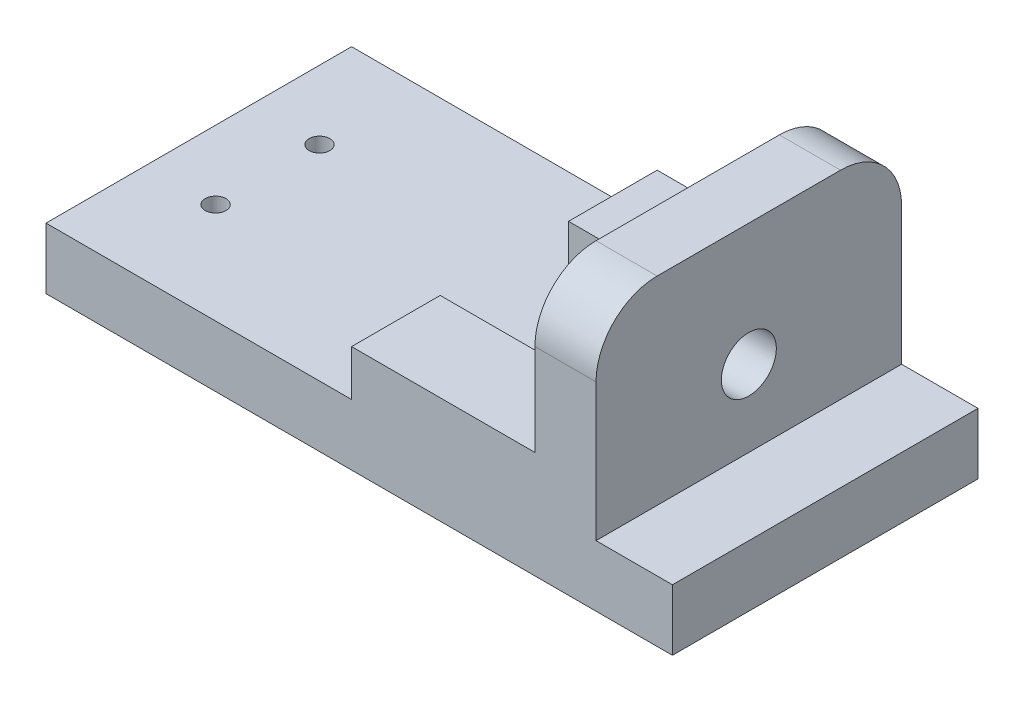
ISO-10303-21;
HEADER;
FILE_DESCRIPTION(('STEP AP214'),'2;1');
FILE_NAME('part.step','',(''),(''),'','','');
FILE_SCHEMA(('AUTOMOTIVE_DESIGN { 1 0 10303 214 1 1 1 1 }'));
ENDSEC;
DATA;
#1=APPLICATION_CONTEXT('core data for automotive mechanical design processes');
#2=APPLICATION_PROTOCOL_DEFINITION('international standard','automotive_design',2000,#1);
#3=PRODUCT_CONTEXT('',#1,'mechanical');
#4=PRODUCT('Part','Part','',(#3));
#5=PRODUCT_RELATED_PRODUCT_CATEGORY('part','',(#4));
#6=PRODUCT_DEFINITION_FORMATION('','',#4);
#7=PRODUCT_DEFINITION_CONTEXT('part definition',#1,'design');
#8=PRODUCT_DEFINITION('design','',#6,#7);
#9=PRODUCT_DEFINITION_SHAPE('','',#8);
#10=(LENGTH_UNIT() NAMED_UNIT(*) SI_UNIT(.MILLI.,.METRE.));
#11=(NAMED_UNIT(*) PLANE_ANGLE_UNIT() SI_UNIT($,.RADIAN.));
#12=(NAMED_UNIT(*) SI_UNIT($,.STERADIAN.) SOLID_ANGLE_UNIT());
#13=UNCERTAINTY_MEASURE_WITH_UNIT(LENGTH_MEASURE(1.E-05),#10,'distance_accuracy_value','');
#14=(GEOMETRIC_REPRESENTATION_CONTEXT(3) GLOBAL_UNCERTAINTY_ASSIGNED_CONTEXT((#13)) GLOBAL_UNIT_ASSIGNED_CONTEXT((#10,
#11,#12)) REPRESENTATION_CONTEXT('',''));
#15=CARTESIAN_POINT('',(0.,0.,0.));
#16=DIRECTION('',(0.,0.,1.));
#17=DIRECTION('',(1.,0.,0.));
#18=AXIS2_PLACEMENT_3D('',#15,#16,#17);
#19=CARTESIAN_POINT('',(0.,20.,0.));
#20=DIRECTION('',(0.,-1.,0.));
#21=DIRECTION('',(0.,0.,-1.));
#22=AXIS2_PLACEMENT_3D('',#19,#20,#21);
#23=PLANE('',#22);
#24=CARTESIAN_POINT('',(22.5,20.,-33.));
#25=DIRECTION('',(0.,1.,0.));
#26=DIRECTION('',(0.,0.,1.));
#27=AXIS2_PLACEMENT_3D('',#24,#25,#26);
#28=CIRCLE('',#27,3.4);
#29=CARTESIAN_POINT('',(22.5,20.,-29.6));
#30=VERTEX_POINT('',#29);
#31=EDGE_CURVE('E238',#30,#30,#28,.T.);
#32=ORIENTED_EDGE('',*,*,#31,.F.);
#33=EDGE_LOOP('',(#32));
#34=FACE_BOUND('',#33,.T.);
#35=CARTESIAN_POINT('',(22.5,20.,-67.));
#36=DIRECTION('',(0.,1.,0.));
#37=DIRECTION('',(0.,0.,1.));
#38=AXIS2_PLACEMENT_3D('',#35,#36,#37);
#39=CIRCLE('',#38,3.4);
#40=CARTESIAN_POINT('',(22.5,20.,-63.6));
#41=VERTEX_POINT('',#40);
#42=EDGE_CURVE('E244',#41,#41,#39,.T.);
#43=ORIENTED_EDGE('',*,*,#42,.F.);
#44=EDGE_LOOP('',(#43));
#45=FACE_BOUND('',#44,.T.);
#46=DIRECTION('',(0.,0.,1.));
#47=VECTOR('',#46,1.);
#48=CARTESIAN_POINT('',(99.9999999999999,20.,-100.));
#49=LINE('',#48,#47);
#50=CARTESIAN_POINT('',(99.9999999999999,20.,-100.));
#51=VERTEX_POINT('',#50);
#52=CARTESIAN_POINT('',(99.9999999999999,20.,-71.));
#53=VERTEX_POINT('',#52);
#54=EDGE_CURVE('E187',#51,#53,#49,.T.);
#55=ORIENTED_EDGE('',*,*,#54,.F.);
#56=DIRECTION('',(-1.,0.,0.));
#57=VECTOR('',#56,1.);
#58=CARTESIAN_POINT('',(0.,20.,-100.));
#59=LINE('',#58,#57);
#60=CARTESIAN_POINT('',(0.,20.,-100.));
#61=VERTEX_POINT('',#60);
#62=EDGE_CURVE('E171',#51,#61,#59,.T.);
#63=ORIENTED_EDGE('',*,*,#62,.T.);
#64=DIRECTION('',(0.,0.,1.));
#65=VECTOR('',#64,1.);
#66=CARTESIAN_POINT('',(0.,20.,0.));
#67=LINE('',#66,#65);
#68=CARTESIAN_POINT('',(0.,20.,0.));
#69=VERTEX_POINT('',#68);
#70=EDGE_CURVE('E251',#61,#69,#67,.T.);
#71=ORIENTED_EDGE('',*,*,#70,.T.);
#72=DIRECTION('',(1.,0.,0.));
#73=VECTOR('',#72,1.);
#74=CARTESIAN_POINT('',(0.,20.,0.));
#75=LINE('',#74,#73);
#76=CARTESIAN_POINT('',(99.9999999999999,20.,0.));
#77=VERTEX_POINT('',#76);
#78=EDGE_CURVE('E256',#69,#77,#75,.T.);
#79=ORIENTED_EDGE('',*,*,#78,.T.);
#80=DIRECTION('',(0.,0.,1.));
#81=VECTOR('',#80,1.);
#82=CARTESIAN_POINT('',(99.9999999999999,20.,0.));
#83=LINE('',#82,#81);
#84=CARTESIAN_POINT('',(99.9999999999999,20.,-29.));
#85=VERTEX_POINT('',#84);
#86=EDGE_CURVE('E199',#85,#77,#83,.T.);
#87=ORIENTED_EDGE('',*,*,#86,.F.);
#88=DIRECTION('',(-1.,0.,0.));
#89=VECTOR('',#88,1.);
#90=CARTESIAN_POINT('',(160.,20.,-29.));
#91=LINE('',#90,#89);
#92=CARTESIAN_POINT('',(160.,20.,-29.));
#93=VERTEX_POINT('',#92);
#94=EDGE_CURVE('E175',#93,#85,#91,.T.);
#95=ORIENTED_EDGE('',*,*,#94,.F.);
#96=DIRECTION('',(0.,0.,-1.));
#97=VECTOR('',#96,1.);
#98=CARTESIAN_POINT('',(160.,20.,0.));
#99=LINE('',#98,#97);
#100=CARTESIAN_POINT('',(160.,20.,-71.));
#101=VERTEX_POINT('',#100);
#102=EDGE_CURVE('E219',#93,#101,#99,.T.);
#103=ORIENTED_EDGE('',*,*,#102,.T.);
#104=DIRECTION('',(1.,0.,0.));
#105=VECTOR('',#104,1.);
#106=CARTESIAN_POINT('',(160.,20.,-71.));
#107=LINE('',#106,#105);
#108=EDGE_CURVE('E189',#53,#101,#107,.T.);
#109=ORIENTED_EDGE('',*,*,#108,.F.);
#110=EDGE_LOOP('',(#55,#63,#71,#79,#87,#95,#103,#109));
#111=FACE_BOUND('',#110,.T.);
#112=ADVANCED_FACE('F44',(#34,#45,#111),#23,.F.);
#113=CARTESIAN_POINT('',(160.,85.,0.));
#114=DIRECTION('',(-1.,0.,0.));
#115=DIRECTION('',(0.,0.,1.));
#116=AXIS2_PLACEMENT_3D('',#113,#114,#115);
#117=PLANE('',#116);
#118=CARTESIAN_POINT('',(160.,45.,-50.));
#119=DIRECTION('',(-1.,0.,0.));
#120=DIRECTION('',(0.,0.,1.));
#121=AXIS2_PLACEMENT_3D('',#118,#119,#120);
#122=CIRCLE('',#121,8.99999999999999);
#123=CARTESIAN_POINT('',(160.,45.,-41.));
#124=VERTEX_POINT('',#123);
#125=EDGE_CURVE('E411',#124,#124,#122,.T.);
#126=ORIENTED_EDGE('',*,*,#125,.F.);
#127=EDGE_LOOP('',(#126));
#128=FACE_BOUND('',#127,.T.);
#129=DIRECTION('',(0.,-1.,0.));
#130=VECTOR('',#129,1.);
#131=CARTESIAN_POINT('',(160.,85.,0.));
#132=LINE('',#131,#130);
#133=CARTESIAN_POINT('',(160.,65.,0.));
#134=VERTEX_POINT('',#133);
#135=CARTESIAN_POINT('',(160.,35.,0.));
#136=VERTEX_POINT('',#135);
#137=EDGE_CURVE('E236',#134,#136,#132,.T.);
#138=ORIENTED_EDGE('',*,*,#137,.F.);
#139=CARTESIAN_POINT('',(160.,65.,-20.));
#140=DIRECTION('',(-1.,0.,0.));
#141=DIRECTION('',(0.,0.,1.));
#142=AXIS2_PLACEMENT_3D('',#139,#140,#141);
#143=CIRCLE('',#142,20.);
#144=CARTESIAN_POINT('',(160.,85.,-20.));
#145=VERTEX_POINT('',#144);
#146=EDGE_CURVE('E52',#134,#145,#143,.T.);
#147=ORIENTED_EDGE('',*,*,#146,.T.);
#148=DIRECTION('',(0.,0.,-1.));
#149=VECTOR('',#148,1.);
#150=CARTESIAN_POINT('',(160.,85.,0.));
#151=LINE('',#150,#149);
#152=CARTESIAN_POINT('',(160.,85.,-80.));
#153=VERTEX_POINT('',#152);
#154=EDGE_CURVE('E220',#145,#153,#151,.T.);
#155=ORIENTED_EDGE('',*,*,#154,.T.);
#156=CARTESIAN_POINT('',(160.,65.,-80.));
#157=DIRECTION('',(-1.,0.,0.));
#158=DIRECTION('',(0.,0.,1.));
#159=AXIS2_PLACEMENT_3D('',#156,#157,#158);
#160=CIRCLE('',#159,20.);
#161=CARTESIAN_POINT('',(160.,65.,-100.));
#162=VERTEX_POINT('',#161);
#163=EDGE_CURVE('E59',#153,#162,#160,.T.);
#164=ORIENTED_EDGE('',*,*,#163,.T.);
#165=DIRECTION('',(0.,-1.,0.));
#166=VECTOR('',#165,1.);
#167=CARTESIAN_POINT('',(160.,85.,-100.));
#168=LINE('',#167,#166);
#169=CARTESIAN_POINT('',(160.,35.,-100.));
#170=VERTEX_POINT('',#169);
#171=EDGE_CURVE('E226',#162,#170,#168,.T.);
#172=ORIENTED_EDGE('',*,*,#171,.T.);
#173=DIRECTION('',(0.,0.,-1.));
#174=VECTOR('',#173,1.);
#175=CARTESIAN_POINT('',(160.,35.,-100.));
#176=LINE('',#175,#174);
#177=CARTESIAN_POINT('',(160.,35.,-71.));
#178=VERTEX_POINT('',#177);
#179=EDGE_CURVE('E164',#178,#170,#176,.T.);
#180=ORIENTED_EDGE('',*,*,#179,.F.);
#181=DIRECTION('',(0.,-1.,0.));
#182=VECTOR('',#181,1.);
#183=CARTESIAN_POINT('',(160.,35.,-71.));
#184=LINE('',#183,#182);
#185=EDGE_CURVE('E183',#178,#101,#184,.T.);
#186=ORIENTED_EDGE('',*,*,#185,.T.);
#187=ORIENTED_EDGE('',*,*,#102,.F.);
#188=DIRECTION('',(0.,-1.,0.));
#189=VECTOR('',#188,1.);
#190=CARTESIAN_POINT('',(160.,35.,-29.));
#191=LINE('',#190,#189);
#192=CARTESIAN_POINT('',(160.,35.,-29.));
#193=VERTEX_POINT('',#192);
#194=EDGE_CURVE('E216',#193,#93,#191,.T.);
#195=ORIENTED_EDGE('',*,*,#194,.F.);
#196=DIRECTION('',(0.,0.,-1.));
#197=VECTOR('',#196,1.);
#198=CARTESIAN_POINT('',(160.,35.,0.));
#199=LINE('',#198,#197);
#200=EDGE_CURVE('E195',#136,#193,#199,.T.);
#201=ORIENTED_EDGE('',*,*,#200,.F.);
#202=EDGE_LOOP('',(#138,#147,#155,#164,#172,#180,#186,#187,#195,#201));
#203=FACE_BOUND('',#202,.T.);
#204=ADVANCED_FACE('F295',(#128,#203),#117,.T.);
#205=DIRECTION('',(0.,0.,-1.));
#206=VECTOR('',#205,1.);
#207=CARTESIAN_POINT('',(180.,20.,0.));
#208=LINE('',#207,#206);
#209=CARTESIAN_POINT('',(180.,20.,0.));
#210=VERTEX_POINT('',#209);
#211=CARTESIAN_POINT('',(180.,20.,-100.));
#212=VERTEX_POINT('',#211);
#213=EDGE_CURVE('E223',#210,#212,#208,.T.);
#214=ORIENTED_EDGE('',*,*,#213,.F.);
#215=CARTESIAN_POINT('',(205.,20.,0.));
#216=VERTEX_POINT('',#215);
#217=EDGE_CURVE('E254',#210,#216,#75,.T.);
#218=ORIENTED_EDGE('',*,*,#217,.T.);
#219=DIRECTION('',(0.,0.,-1.));
#220=VECTOR('',#219,1.);
#221=CARTESIAN_POINT('',(205.,20.,0.));
#222=LINE('',#221,#220);
#223=CARTESIAN_POINT('',(205.,20.,-100.));
#224=VERTEX_POINT('',#223);
#225=EDGE_CURVE('E258',#216,#224,#222,.T.);
#226=ORIENTED_EDGE('',*,*,#225,.T.);
#227=EDGE_CURVE('E260',#224,#212,#59,.T.);
#228=ORIENTED_EDGE('',*,*,#227,.T.);
#229=EDGE_LOOP('',(#214,#218,#226,#228));
#230=FACE_BOUND('',#229,.T.);
#231=ADVANCED_FACE('F312',(#230),#23,.F.);
#232=CARTESIAN_POINT('',(0.,0.,0.));
#233=DIRECTION('',(0.,-1.,0.));
#234=DIRECTION('',(0.,0.,-1.));
#235=AXIS2_PLACEMENT_3D('',#232,#233,#234);
#236=PLANE('',#235);
#237=DIRECTION('',(0.,0.,1.));
#238=VECTOR('',#237,1.);
#239=CARTESIAN_POINT('',(0.,0.,0.));
#240=LINE('',#239,#238);
#241=CARTESIAN_POINT('',(0.,0.,-100.));
#242=VERTEX_POINT('',#241);
#243=CARTESIAN_POINT('',(0.,0.,0.));
#244=VERTEX_POINT('',#243);
#245=EDGE_CURVE('E250',#242,#244,#240,.T.);
#246=ORIENTED_EDGE('',*,*,#245,.F.);
#247=DIRECTION('',(-1.,0.,0.));
#248=VECTOR('',#247,1.);
#249=CARTESIAN_POINT('',(0.,0.,-100.));
#250=LINE('',#249,#248);
#251=CARTESIAN_POINT('',(205.,0.,-100.));
#252=VERTEX_POINT('',#251);
#253=EDGE_CURVE('E255',#252,#242,#250,.T.);
#254=ORIENTED_EDGE('',*,*,#253,.F.);
#255=DIRECTION('',(0.,0.,-1.));
#256=VECTOR('',#255,1.);
#257=CARTESIAN_POINT('',(205.,0.,0.));
#258=LINE('',#257,#256);
#259=CARTESIAN_POINT('',(205.,0.,0.));
#260=VERTEX_POINT('',#259);
#261=EDGE_CURVE('E268',#260,#252,#258,.T.);
#262=ORIENTED_EDGE('',*,*,#261,.F.);
#263=DIRECTION('',(1.,0.,0.));
#264=VECTOR('',#263,1.);
#265=CARTESIAN_POINT('',(0.,0.,0.));
#266=LINE('',#265,#264);
#267=EDGE_CURVE('E266',#244,#260,#266,.T.);
#268=ORIENTED_EDGE('',*,*,#267,.F.);
#269=EDGE_LOOP('',(#246,#254,#262,#268));
#270=FACE_BOUND('',#269,.T.);
#271=CARTESIAN_POINT('',(22.5,0.,-67.));
#272=DIRECTION('',(0.,1.,0.));
#273=DIRECTION('',(0.,0.,1.));
#274=AXIS2_PLACEMENT_3D('',#271,#272,#273);
#275=CIRCLE('',#274,3.39999999999999);
#276=CARTESIAN_POINT('',(22.5,0.,-63.6));
#277=VERTEX_POINT('',#276);
#278=EDGE_CURVE('E247',#277,#277,#275,.T.);
#279=ORIENTED_EDGE('',*,*,#278,.T.);
#280=EDGE_LOOP('',(#279));
#281=FACE_BOUND('',#280,.T.);
#282=CARTESIAN_POINT('',(22.5,0.,-33.));
#283=DIRECTION('',(0.,1.,0.));
#284=DIRECTION('',(0.,0.,1.));
#285=AXIS2_PLACEMENT_3D('',#282,#283,#284);
#286=CIRCLE('',#285,3.39999999999999);
#287=CARTESIAN_POINT('',(22.5,0.,-29.6));
#288=VERTEX_POINT('',#287);
#289=EDGE_CURVE('E241',#288,#288,#286,.T.);
#290=ORIENTED_EDGE('',*,*,#289,.T.);
#291=EDGE_LOOP('',(#290));
#292=FACE_BOUND('',#291,.T.);
#293=ADVANCED_FACE('F345',(#270,#281,#292),#236,.T.);
#294=CARTESIAN_POINT('',(0.,20.,0.));
#295=DIRECTION('',(1.,0.,0.));
#296=DIRECTION('',(0.,0.,-1.));
#297=AXIS2_PLACEMENT_3D('',#294,#295,#296);
#298=PLANE('',#297);
#299=ORIENTED_EDGE('',*,*,#245,.T.);
#300=DIRECTION('',(0.,-1.,0.));
#301=VECTOR('',#300,1.);
#302=CARTESIAN_POINT('',(0.,20.,0.));
#303=LINE('',#302,#301);
#304=EDGE_CURVE('E279',#69,#244,#303,.T.);
#305=ORIENTED_EDGE('',*,*,#304,.F.);
#306=ORIENTED_EDGE('',*,*,#70,.F.);
#307=DIRECTION('',(0.,-1.,0.));
#308=VECTOR('',#307,1.);
#309=CARTESIAN_POINT('',(0.,20.,-100.));
#310=LINE('',#309,#308);
#311=EDGE_CURVE('E263',#61,#242,#310,.T.);
#312=ORIENTED_EDGE('',*,*,#311,.T.);
#313=EDGE_LOOP('',(#299,#305,#306,#312));
#314=FACE_BOUND('',#313,.T.);
#315=ADVANCED_FACE('F338',(#314),#298,.F.);
#316=CARTESIAN_POINT('',(0.,20.,0.));
#317=DIRECTION('',(0.,0.,-1.));
#318=DIRECTION('',(-1.,0.,0.));
#319=AXIS2_PLACEMENT_3D('',#316,#317,#318);
#320=PLANE('',#319);
#321=DIRECTION('',(0.,-1.,0.));
#322=VECTOR('',#321,1.);
#323=CARTESIAN_POINT('',(180.,85.,0.));
#324=LINE('',#323,#322);
#325=CARTESIAN_POINT('',(180.,65.,0.));
#326=VERTEX_POINT('',#325);
#327=EDGE_CURVE('E234',#326,#210,#324,.T.);
#328=ORIENTED_EDGE('',*,*,#327,.F.);
#329=DIRECTION('',(1.,0.,0.));
#330=VECTOR('',#329,1.);
#331=CARTESIAN_POINT('',(160.,65.,0.));
#332=LINE('',#331,#330);
#333=EDGE_CURVE('E67',#326,#134,#332,.F.);
#334=ORIENTED_EDGE('',*,*,#333,.T.);
#335=ORIENTED_EDGE('',*,*,#137,.T.);
#336=DIRECTION('',(1.,0.,0.));
#337=VECTOR('',#336,1.);
#338=CARTESIAN_POINT('',(160.,35.,0.));
#339=LINE('',#338,#337);
#340=CARTESIAN_POINT('',(99.9999999999999,35.,0.));
#341=VERTEX_POINT('',#340);
#342=EDGE_CURVE('E203',#341,#136,#339,.T.);
#343=ORIENTED_EDGE('',*,*,#342,.F.);
#344=DIRECTION('',(0.,-1.,0.));
#345=VECTOR('',#344,1.);
#346=CARTESIAN_POINT('',(99.9999999999999,35.,0.));
#347=LINE('',#346,#345);
#348=EDGE_CURVE('E206',#341,#77,#347,.T.);
#349=ORIENTED_EDGE('',*,*,#348,.T.);
#350=ORIENTED_EDGE('',*,*,#78,.F.);
#351=ORIENTED_EDGE('',*,*,#304,.T.);
#352=ORIENTED_EDGE('',*,*,#267,.T.);
#353=DIRECTION('',(0.,-1.,0.));
#354=VECTOR('',#353,1.);
#355=CARTESIAN_POINT('',(205.,20.,0.));
#356=LINE('',#355,#354);
#357=EDGE_CURVE('E276',#216,#260,#356,.T.);
#358=ORIENTED_EDGE('',*,*,#357,.F.);
#359=ORIENTED_EDGE('',*,*,#217,.F.);
#360=EDGE_LOOP('',(#328,#334,#335,#343,#349,#350,#351,#352,#358,#359));
#361=FACE_BOUND('',#360,.T.);
#362=ADVANCED_FACE('F308',(#361),#320,.F.);
#363=CARTESIAN_POINT('',(205.,20.,0.));
#364=DIRECTION('',(-1.,0.,0.));
#365=DIRECTION('',(0.,0.,1.));
#366=AXIS2_PLACEMENT_3D('',#363,#364,#365);
#367=PLANE('',#366);
#368=ORIENTED_EDGE('',*,*,#261,.T.);
#369=DIRECTION('',(0.,-1.,0.));
#370=VECTOR('',#369,1.);
#371=CARTESIAN_POINT('',(205.,20.,-100.));
#372=LINE('',#371,#370);
#373=EDGE_CURVE('E273',#224,#252,#372,.T.);
#374=ORIENTED_EDGE('',*,*,#373,.F.);
#375=ORIENTED_EDGE('',*,*,#225,.F.);
#376=ORIENTED_EDGE('',*,*,#357,.T.);
#377=EDGE_LOOP('',(#368,#374,#375,#376));
#378=FACE_BOUND('',#377,.T.);
#379=ADVANCED_FACE('F343',(#378),#367,.F.);
#380=CARTESIAN_POINT('',(0.,20.,-100.));
#381=DIRECTION('',(0.,0.,1.));
#382=DIRECTION('',(1.,0.,0.));
#383=AXIS2_PLACEMENT_3D('',#380,#381,#382);
#384=PLANE('',#383);
#385=ORIENTED_EDGE('',*,*,#171,.F.);
#386=DIRECTION('',(-1.,0.,0.));
#387=VECTOR('',#386,1.);
#388=CARTESIAN_POINT('',(180.,65.,-100.));
#389=LINE('',#388,#387);
#390=CARTESIAN_POINT('',(180.,65.,-100.));
#391=VERTEX_POINT('',#390);
#392=EDGE_CURVE('E11',#162,#391,#389,.F.);
#393=ORIENTED_EDGE('',*,*,#392,.T.);
#394=DIRECTION('',(0.,-1.,0.));
#395=VECTOR('',#394,1.);
#396=CARTESIAN_POINT('',(180.,85.,-100.));
#397=LINE('',#396,#395);
#398=EDGE_CURVE('E232',#391,#212,#397,.T.);
#399=ORIENTED_EDGE('',*,*,#398,.T.);
#400=ORIENTED_EDGE('',*,*,#227,.F.);
#401=ORIENTED_EDGE('',*,*,#373,.T.);
#402=ORIENTED_EDGE('',*,*,#253,.T.);
#403=ORIENTED_EDGE('',*,*,#311,.F.);
#404=ORIENTED_EDGE('',*,*,#62,.F.);
#405=DIRECTION('',(0.,-1.,0.));
#406=VECTOR('',#405,1.);
#407=CARTESIAN_POINT('',(99.9999999999999,35.,-100.));
#408=LINE('',#407,#406);
#409=CARTESIAN_POINT('',(99.9999999999999,35.,-100.));
#410=VERTEX_POINT('',#409);
#411=EDGE_CURVE('E168',#410,#51,#408,.T.);
#412=ORIENTED_EDGE('',*,*,#411,.F.);
#413=DIRECTION('',(-1.,0.,0.));
#414=VECTOR('',#413,1.);
#415=CARTESIAN_POINT('',(160.,35.,-100.));
#416=LINE('',#415,#414);
#417=EDGE_CURVE('E157',#170,#410,#416,.T.);
#418=ORIENTED_EDGE('',*,*,#417,.F.);
#419=EDGE_LOOP('',(#385,#393,#399,#400,#401,#402,#403,#404,#412,#418));
#420=FACE_BOUND('',#419,.T.);
#421=ADVANCED_FACE('F169',(#420),#384,.F.);
#422=CARTESIAN_POINT('',(22.5,20.,-67.));
#423=DIRECTION('',(0.,1.,0.));
#424=DIRECTION('',(0.,0.,1.));
#425=AXIS2_PLACEMENT_3D('',#422,#423,#424);
#426=CYLINDRICAL_SURFACE('',#425,3.4);
#427=ORIENTED_EDGE('',*,*,#278,.F.);
#428=EDGE_LOOP('',(#427));
#429=FACE_BOUND('',#428,.T.);
#430=ORIENTED_EDGE('',*,*,#42,.T.);
#431=EDGE_LOOP('',(#430));
#432=FACE_BOUND('',#431,.T.);
#433=ADVANCED_FACE('F356',(#429,#432),#426,.F.);
#434=CARTESIAN_POINT('',(22.5,20.,-33.));
#435=DIRECTION('',(0.,1.,0.));
#436=DIRECTION('',(0.,0.,1.));
#437=AXIS2_PLACEMENT_3D('',#434,#435,#436);
#438=CYLINDRICAL_SURFACE('',#437,3.4);
#439=ORIENTED_EDGE('',*,*,#289,.F.);
#440=EDGE_LOOP('',(#439));
#441=FACE_BOUND('',#440,.T.);
#442=ORIENTED_EDGE('',*,*,#31,.T.);
#443=EDGE_LOOP('',(#442));
#444=FACE_BOUND('',#443,.T.);
#445=ADVANCED_FACE('F353',(#441,#444),#438,.F.);
#446=CARTESIAN_POINT('',(180.,85.,0.));
#447=DIRECTION('',(-1.,0.,0.));
#448=DIRECTION('',(0.,0.,1.));
#449=AXIS2_PLACEMENT_3D('',#446,#447,#448);
#450=PLANE('',#449);
#451=CARTESIAN_POINT('',(180.,45.,-50.));
#452=DIRECTION('',(-1.,0.,0.));
#453=DIRECTION('',(0.,0.,1.));
#454=AXIS2_PLACEMENT_3D('',#451,#452,#453);
#455=CIRCLE('',#454,8.99999999999999);
#456=CARTESIAN_POINT('',(180.,45.,-41.));
#457=VERTEX_POINT('',#456);
#458=EDGE_CURVE('E190',#457,#457,#455,.T.);
#459=ORIENTED_EDGE('',*,*,#458,.T.);
#460=EDGE_LOOP('',(#459));
#461=FACE_BOUND('',#460,.T.);
#462=DIRECTION('',(0.,0.,-1.));
#463=VECTOR('',#462,1.);
#464=CARTESIAN_POINT('',(180.,85.,0.));
#465=LINE('',#464,#463);
#466=CARTESIAN_POINT('',(180.,85.,-20.));
#467=VERTEX_POINT('',#466);
#468=CARTESIAN_POINT('',(180.,85.,-80.));
#469=VERTEX_POINT('',#468);
#470=EDGE_CURVE('E222',#467,#469,#465,.T.);
#471=ORIENTED_EDGE('',*,*,#470,.F.);
#472=CARTESIAN_POINT('',(180.,65.,-20.));
#473=DIRECTION('',(-1.,0.,0.));
#474=DIRECTION('',(0.,0.,1.));
#475=AXIS2_PLACEMENT_3D('',#472,#473,#474);
#476=CIRCLE('',#475,20.);
#477=EDGE_CURVE('E290',#467,#326,#476,.F.);
#478=ORIENTED_EDGE('',*,*,#477,.T.);
#479=ORIENTED_EDGE('',*,*,#327,.T.);
#480=ORIENTED_EDGE('',*,*,#213,.T.);
#481=ORIENTED_EDGE('',*,*,#398,.F.);
#482=CARTESIAN_POINT('',(180.,65.,-80.));
#483=DIRECTION('',(-1.,0.,0.));
#484=DIRECTION('',(0.,0.,1.));
#485=AXIS2_PLACEMENT_3D('',#482,#483,#484);
#486=CIRCLE('',#485,20.);
#487=EDGE_CURVE('E288',#391,#469,#486,.F.);
#488=ORIENTED_EDGE('',*,*,#487,.T.);
#489=EDGE_LOOP('',(#471,#478,#479,#480,#481,#488));
#490=FACE_BOUND('',#489,.T.);
#491=ADVANCED_FACE('F305',(#461,#490),#450,.F.);
#492=CARTESIAN_POINT('',(0.,85.,0.));
#493=DIRECTION('',(0.,1.,0.));
#494=DIRECTION('',(0.,0.,1.));
#495=AXIS2_PLACEMENT_3D('',#492,#493,#494);
#496=PLANE('',#495);
#497=ORIENTED_EDGE('',*,*,#154,.F.);
#498=DIRECTION('',(1.,0.,0.));
#499=VECTOR('',#498,1.);
#500=CARTESIAN_POINT('',(180.,85.,-20.));
#501=LINE('',#500,#499);
#502=EDGE_CURVE('E285',#145,#467,#501,.T.);
#503=ORIENTED_EDGE('',*,*,#502,.T.);
#504=ORIENTED_EDGE('',*,*,#470,.T.);
#505=DIRECTION('',(-1.,0.,0.));
#506=VECTOR('',#505,1.);
#507=CARTESIAN_POINT('',(160.,85.,-80.));
#508=LINE('',#507,#506);
#509=EDGE_CURVE('E282',#469,#153,#508,.T.);
#510=ORIENTED_EDGE('',*,*,#509,.T.);
#511=EDGE_LOOP('',(#497,#503,#504,#510));
#512=FACE_BOUND('',#511,.T.);
#513=ADVANCED_FACE('F300',(#512),#496,.T.);
#514=CARTESIAN_POINT('',(160.,35.,-29.));
#515=DIRECTION('',(0.,0.,1.));
#516=DIRECTION('',(1.,0.,0.));
#517=AXIS2_PLACEMENT_3D('',#514,#515,#516);
#518=PLANE('',#517);
#519=ORIENTED_EDGE('',*,*,#94,.T.);
#520=DIRECTION('',(0.,-1.,0.));
#521=VECTOR('',#520,1.);
#522=CARTESIAN_POINT('',(99.9999999999999,35.,-29.));
#523=LINE('',#522,#521);
#524=CARTESIAN_POINT('',(99.9999999999999,35.,-29.));
#525=VERTEX_POINT('',#524);
#526=EDGE_CURVE('E213',#525,#85,#523,.T.);
#527=ORIENTED_EDGE('',*,*,#526,.F.);
#528=DIRECTION('',(-1.,0.,0.));
#529=VECTOR('',#528,1.);
#530=CARTESIAN_POINT('',(160.,35.,-29.));
#531=LINE('',#530,#529);
#532=EDGE_CURVE('E198',#193,#525,#531,.T.);
#533=ORIENTED_EDGE('',*,*,#532,.F.);
#534=ORIENTED_EDGE('',*,*,#194,.T.);
#535=EDGE_LOOP('',(#519,#527,#533,#534));
#536=FACE_BOUND('',#535,.T.);
#537=ADVANCED_FACE('F326',(#536),#518,.F.);
#538=CARTESIAN_POINT('',(99.9999999999999,35.,0.));
#539=DIRECTION('',(1.,0.,0.));
#540=DIRECTION('',(0.,0.,-1.));
#541=AXIS2_PLACEMENT_3D('',#538,#539,#540);
#542=PLANE('',#541);
#543=ORIENTED_EDGE('',*,*,#86,.T.);
#544=ORIENTED_EDGE('',*,*,#348,.F.);
#545=DIRECTION('',(0.,0.,1.));
#546=VECTOR('',#545,1.);
#547=CARTESIAN_POINT('',(99.9999999999999,35.,0.));
#548=LINE('',#547,#546);
#549=EDGE_CURVE('E201',#525,#341,#548,.T.);
#550=ORIENTED_EDGE('',*,*,#549,.F.);
#551=ORIENTED_EDGE('',*,*,#526,.T.);
#552=EDGE_LOOP('',(#543,#544,#550,#551));
#553=FACE_BOUND('',#552,.T.);
#554=ADVANCED_FACE('F334',(#553),#542,.F.);
#555=CARTESIAN_POINT('',(0.,35.,0.));
#556=DIRECTION('',(0.,1.,0.));
#557=DIRECTION('',(0.,0.,1.));
#558=AXIS2_PLACEMENT_3D('',#555,#556,#557);
#559=PLANE('',#558);
#560=ORIENTED_EDGE('',*,*,#200,.T.);
#561=ORIENTED_EDGE('',*,*,#532,.T.);
#562=ORIENTED_EDGE('',*,*,#549,.T.);
#563=ORIENTED_EDGE('',*,*,#342,.T.);
#564=EDGE_LOOP('',(#560,#561,#562,#563));
#565=FACE_BOUND('',#564,.T.);
#566=ADVANCED_FACE('F330',(#565),#559,.T.);
#567=CARTESIAN_POINT('',(99.9999999999999,35.,-100.));
#568=DIRECTION('',(1.,0.,0.));
#569=DIRECTION('',(0.,0.,-1.));
#570=AXIS2_PLACEMENT_3D('',#567,#568,#569);
#571=PLANE('',#570);
#572=ORIENTED_EDGE('',*,*,#54,.T.);
#573=DIRECTION('',(0.,-1.,0.));
#574=VECTOR('',#573,1.);
#575=CARTESIAN_POINT('',(99.9999999999999,35.,-71.));
#576=LINE('',#575,#574);
#577=CARTESIAN_POINT('',(99.9999999999999,35.,-71.));
#578=VERTEX_POINT('',#577);
#579=EDGE_CURVE('E176',#578,#53,#576,.T.);
#580=ORIENTED_EDGE('',*,*,#579,.F.);
#581=DIRECTION('',(0.,0.,1.));
#582=VECTOR('',#581,1.);
#583=CARTESIAN_POINT('',(99.9999999999999,35.,-100.));
#584=LINE('',#583,#582);
#585=EDGE_CURVE('E162',#410,#578,#584,.T.);
#586=ORIENTED_EDGE('',*,*,#585,.F.);
#587=ORIENTED_EDGE('',*,*,#411,.T.);
#588=EDGE_LOOP('',(#572,#580,#586,#587));
#589=FACE_BOUND('',#588,.T.);
#590=ADVANCED_FACE('F178',(#589),#571,.F.);
#591=CARTESIAN_POINT('',(160.,35.,-71.));
#592=DIRECTION('',(0.,0.,-1.));
#593=DIRECTION('',(-1.,0.,0.));
#594=AXIS2_PLACEMENT_3D('',#591,#592,#593);
#595=PLANE('',#594);
#596=ORIENTED_EDGE('',*,*,#108,.T.);
#597=ORIENTED_EDGE('',*,*,#185,.F.);
#598=DIRECTION('',(1.,0.,0.));
#599=VECTOR('',#598,1.);
#600=CARTESIAN_POINT('',(160.,35.,-71.));
#601=LINE('',#600,#599);
#602=EDGE_CURVE('E181',#578,#178,#601,.T.);
#603=ORIENTED_EDGE('',*,*,#602,.F.);
#604=ORIENTED_EDGE('',*,*,#579,.T.);
#605=EDGE_LOOP('',(#596,#597,#603,#604));
#606=FACE_BOUND('',#605,.T.);
#607=ADVANCED_FACE('F322',(#606),#595,.F.);
#608=CARTESIAN_POINT('',(0.,35.,0.));
#609=DIRECTION('',(0.,-1.,0.));
#610=DIRECTION('',(0.,0.,-1.));
#611=AXIS2_PLACEMENT_3D('',#608,#609,#610);
#612=PLANE('',#611);
#613=ORIENTED_EDGE('',*,*,#179,.T.);
#614=ORIENTED_EDGE('',*,*,#417,.T.);
#615=ORIENTED_EDGE('',*,*,#585,.T.);
#616=ORIENTED_EDGE('',*,*,#602,.T.);
#617=EDGE_LOOP('',(#613,#614,#615,#616));
#618=FACE_BOUND('',#617,.T.);
#619=ADVANCED_FACE('F159',(#618),#612,.F.);
#620=CARTESIAN_POINT('',(0.,65.,-20.));
#621=DIRECTION('',(-1.,0.,0.));
#622=DIRECTION('',(0.,0.,1.));
#623=AXIS2_PLACEMENT_3D('',#620,#621,#622);
#624=CYLINDRICAL_SURFACE('',#623,20.);
#625=ORIENTED_EDGE('',*,*,#146,.F.);
#626=ORIENTED_EDGE('',*,*,#333,.F.);
#627=ORIENTED_EDGE('',*,*,#477,.F.);
#628=ORIENTED_EDGE('',*,*,#502,.F.);
#629=EDGE_LOOP('',(#625,#626,#627,#628));
#630=FACE_BOUND('',#629,.T.);
#631=ADVANCED_FACE('F303',(#630),#624,.T.);
#632=CARTESIAN_POINT('',(0.,65.,-80.));
#633=DIRECTION('',(1.,0.,0.));
#634=DIRECTION('',(0.,0.,-1.));
#635=AXIS2_PLACEMENT_3D('',#632,#633,#634);
#636=CYLINDRICAL_SURFACE('',#635,20.);
#637=ORIENTED_EDGE('',*,*,#487,.F.);
#638=ORIENTED_EDGE('',*,*,#392,.F.);
#639=ORIENTED_EDGE('',*,*,#163,.F.);
#640=ORIENTED_EDGE('',*,*,#509,.F.);
#641=EDGE_LOOP('',(#637,#638,#639,#640));
#642=FACE_BOUND('',#641,.T.);
#643=ADVANCED_FACE('F46',(#642),#636,.T.);
#644=CARTESIAN_POINT('',(160.,45.,-50.));
#645=DIRECTION('',(-1.,0.,0.));
#646=DIRECTION('',(0.,0.,1.));
#647=AXIS2_PLACEMENT_3D('',#644,#645,#646);
#648=CYLINDRICAL_SURFACE('',#647,8.99999999999999);
#649=ORIENTED_EDGE('',*,*,#125,.T.);
#650=EDGE_LOOP('',(#649));
#651=FACE_BOUND('',#650,.T.);
#652=ORIENTED_EDGE('',*,*,#458,.F.);
#653=EDGE_LOOP('',(#652));
#654=FACE_BOUND('',#653,.T.);
#655=ADVANCED_FACE('F384',(#651,#654),#648,.F.);
#656=CLOSED_SHELL('',(#112,#204,#231,#293,#315,#362,#379,#421,#433,#445,#491,#513,#537,#554,
#566,#590,#607,#619,#631,#643,#655));
#657=MANIFOLD_SOLID_BREP('B2',#656);
#658=ADVANCED_BREP_SHAPE_REPRESENTATION('',(#18,#657),#14);
#659=SHAPE_DEFINITION_REPRESENTATION(#9,#658);
ENDSEC;
END-ISO-10303-21;
